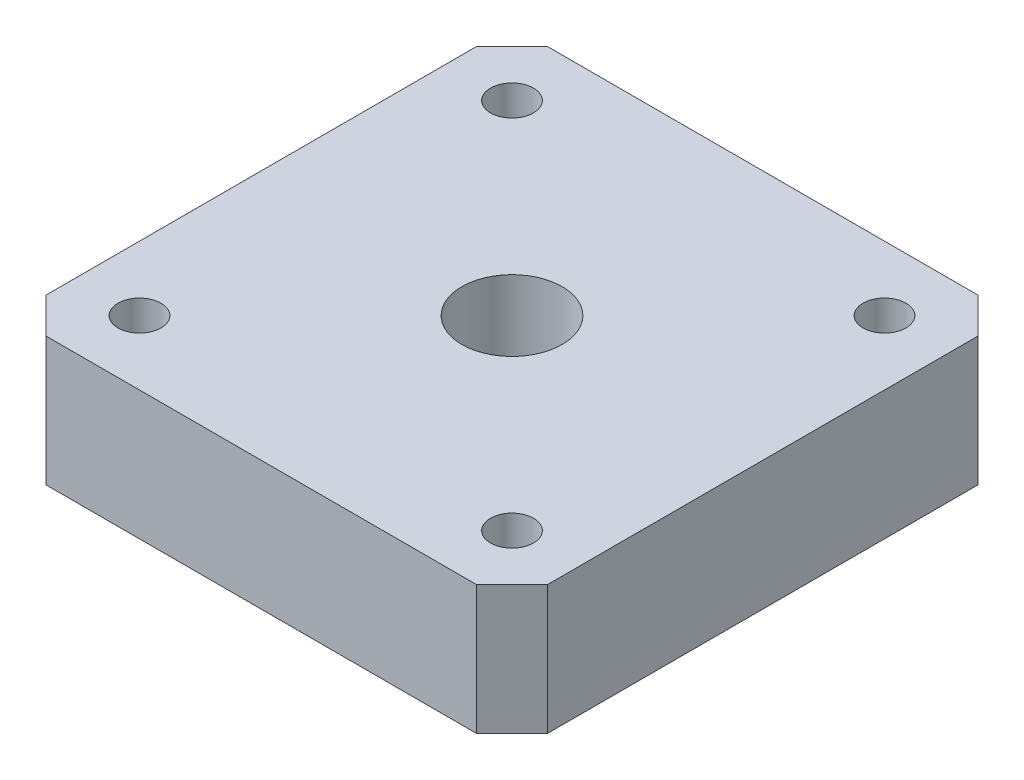
ISO-10303-21;
HEADER;
FILE_DESCRIPTION(('STEP AP214'),'2;1');
FILE_NAME('part.step','',(''),(''),'','','');
FILE_SCHEMA(('AUTOMOTIVE_DESIGN { 1 0 10303 214 1 1 1 1 }'));
ENDSEC;
DATA;
#1=APPLICATION_CONTEXT('core data for automotive mechanical design processes');
#2=APPLICATION_PROTOCOL_DEFINITION('international standard','automotive_design',2000,#1);
#3=PRODUCT_CONTEXT('',#1,'mechanical');
#4=PRODUCT('Part','Part','',(#3));
#5=PRODUCT_RELATED_PRODUCT_CATEGORY('part','',(#4));
#6=PRODUCT_DEFINITION_FORMATION('','',#4);
#7=PRODUCT_DEFINITION_CONTEXT('part definition',#1,'design');
#8=PRODUCT_DEFINITION('design','',#6,#7);
#9=PRODUCT_DEFINITION_SHAPE('','',#8);
#10=(LENGTH_UNIT() NAMED_UNIT(*) SI_UNIT(.MILLI.,.METRE.));
#11=(NAMED_UNIT(*) PLANE_ANGLE_UNIT() SI_UNIT($,.RADIAN.));
#12=(NAMED_UNIT(*) SI_UNIT($,.STERADIAN.) SOLID_ANGLE_UNIT());
#13=UNCERTAINTY_MEASURE_WITH_UNIT(LENGTH_MEASURE(1.E-05),#10,'distance_accuracy_value','');
#14=(GEOMETRIC_REPRESENTATION_CONTEXT(3) GLOBAL_UNCERTAINTY_ASSIGNED_CONTEXT((#13)) GLOBAL_UNIT_ASSIGNED_CONTEXT((#10,
#11,#12)) REPRESENTATION_CONTEXT('',''));
#15=CARTESIAN_POINT('',(0.,0.,0.));
#16=DIRECTION('',(0.,0.,1.));
#17=DIRECTION('',(1.,0.,0.));
#18=AXIS2_PLACEMENT_3D('',#15,#16,#17);
#19=CARTESIAN_POINT('',(0.,9.,-32.5269119345811));
#20=DIRECTION('',(1.,0.,0.));
#21=DIRECTION('',(0.,0.,-1.));
#22=AXIS2_PLACEMENT_3D('',#19,#20,#21);
#23=PLANE('',#22);
#24=DIRECTION('',(0.,0.,1.));
#25=VECTOR('',#24,1.);
#26=CARTESIAN_POINT('',(0.,0.,-32.5269119345811));
#27=LINE('',#26,#25);
#28=CARTESIAN_POINT('',(0.,0.,-32.5269119345811));
#29=VERTEX_POINT('',#28);
#30=CARTESIAN_POINT('',(0.,0.,-2.47308806541876));
#31=VERTEX_POINT('',#30);
#32=EDGE_CURVE('E129',#29,#31,#27,.T.);
#33=ORIENTED_EDGE('',*,*,#32,.T.);
#34=DIRECTION('',(0.,-1.,0.));
#35=VECTOR('',#34,1.);
#36=CARTESIAN_POINT('',(0.,9.,-2.47308806541876));
#37=LINE('',#36,#35);
#38=CARTESIAN_POINT('',(0.,9.,-2.47308806541876));
#39=VERTEX_POINT('',#38);
#40=EDGE_CURVE('E11',#39,#31,#37,.T.);
#41=ORIENTED_EDGE('',*,*,#40,.F.);
#42=DIRECTION('',(0.,0.,1.));
#43=VECTOR('',#42,1.);
#44=CARTESIAN_POINT('',(0.,9.,-32.5269119345811));
#45=LINE('',#44,#43);
#46=CARTESIAN_POINT('',(0.,9.,-32.5269119345811));
#47=VERTEX_POINT('',#46);
#48=EDGE_CURVE('E144',#47,#39,#45,.T.);
#49=ORIENTED_EDGE('',*,*,#48,.F.);
#50=DIRECTION('',(0.,-1.,0.));
#51=VECTOR('',#50,1.);
#52=CARTESIAN_POINT('',(0.,9.,-32.5269119345811));
#53=LINE('',#52,#51);
#54=EDGE_CURVE('E125',#47,#29,#53,.T.);
#55=ORIENTED_EDGE('',*,*,#54,.T.);
#56=EDGE_LOOP('',(#33,#41,#49,#55));
#57=FACE_BOUND('',#56,.T.);
#58=ADVANCED_FACE('F33',(#57),#23,.F.);
#59=CARTESIAN_POINT('',(0.,9.,-2.47308806541876));
#60=DIRECTION('',(0.707106781186549,0.,-0.707106781186546));
#61=DIRECTION('',(-0.707106781186546,0.,-0.707106781186549));
#62=AXIS2_PLACEMENT_3D('',#59,#60,#61);
#63=PLANE('',#62);
#64=DIRECTION('',(0.707106781186546,0.,0.707106781186548));
#65=VECTOR('',#64,1.);
#66=CARTESIAN_POINT('',(0.,0.,-2.47308806541876));
#67=LINE('',#66,#65);
#68=CARTESIAN_POINT('',(2.47308806541877,0.,0.));
#69=VERTEX_POINT('',#68);
#70=EDGE_CURVE('E132',#31,#69,#67,.T.);
#71=ORIENTED_EDGE('',*,*,#70,.T.);
#72=DIRECTION('',(0.,-1.,0.));
#73=VECTOR('',#72,1.);
#74=CARTESIAN_POINT('',(2.47308806541877,9.,0.));
#75=LINE('',#74,#73);
#76=CARTESIAN_POINT('',(2.47308806541877,9.,0.));
#77=VERTEX_POINT('',#76);
#78=EDGE_CURVE('E41',#77,#69,#75,.T.);
#79=ORIENTED_EDGE('',*,*,#78,.F.);
#80=DIRECTION('',(0.707106781186546,0.,0.707106781186548));
#81=VECTOR('',#80,1.);
#82=CARTESIAN_POINT('',(0.,9.,-2.47308806541876));
#83=LINE('',#82,#81);
#84=EDGE_CURVE('E92',#39,#77,#83,.T.);
#85=ORIENTED_EDGE('',*,*,#84,.F.);
#86=ORIENTED_EDGE('',*,*,#40,.T.);
#87=EDGE_LOOP('',(#71,#79,#85,#86));
#88=FACE_BOUND('',#87,.T.);
#89=ADVANCED_FACE('F244',(#88),#63,.F.);
#90=CARTESIAN_POINT('',(2.47308806541877,9.,0.));
#91=DIRECTION('',(0.,0.,-1.));
#92=DIRECTION('',(-1.,0.,0.));
#93=AXIS2_PLACEMENT_3D('',#90,#91,#92);
#94=PLANE('',#93);
#95=DIRECTION('',(1.,0.,0.));
#96=VECTOR('',#95,1.);
#97=CARTESIAN_POINT('',(2.47308806541877,0.,0.));
#98=LINE('',#97,#96);
#99=CARTESIAN_POINT('',(32.5269119345812,0.,0.));
#100=VERTEX_POINT('',#99);
#101=EDGE_CURVE('E135',#69,#100,#98,.T.);
#102=ORIENTED_EDGE('',*,*,#101,.T.);
#103=DIRECTION('',(0.,-1.,0.));
#104=VECTOR('',#103,1.);
#105=CARTESIAN_POINT('',(32.5269119345812,9.,0.));
#106=LINE('',#105,#104);
#107=CARTESIAN_POINT('',(32.5269119345812,9.,0.));
#108=VERTEX_POINT('',#107);
#109=EDGE_CURVE('E151',#108,#100,#106,.T.);
#110=ORIENTED_EDGE('',*,*,#109,.F.);
#111=DIRECTION('',(1.,0.,0.));
#112=VECTOR('',#111,1.);
#113=CARTESIAN_POINT('',(2.47308806541877,9.,0.));
#114=LINE('',#113,#112);
#115=EDGE_CURVE('E159',#77,#108,#114,.T.);
#116=ORIENTED_EDGE('',*,*,#115,.F.);
#117=ORIENTED_EDGE('',*,*,#78,.T.);
#118=EDGE_LOOP('',(#102,#110,#116,#117));
#119=FACE_BOUND('',#118,.T.);
#120=ADVANCED_FACE('F157',(#119),#94,.F.);
#121=CARTESIAN_POINT('',(32.5269119345812,9.,0.));
#122=DIRECTION('',(-0.707106781186545,0.,-0.70710678118655));
#123=DIRECTION('',(-0.70710678118655,0.,0.707106781186545));
#124=AXIS2_PLACEMENT_3D('',#121,#122,#123);
#125=PLANE('',#124);
#126=DIRECTION('',(0.70710678118655,0.,-0.707106781186545));
#127=VECTOR('',#126,1.);
#128=CARTESIAN_POINT('',(32.5269119345812,0.,0.));
#129=LINE('',#128,#127);
#130=CARTESIAN_POINT('',(35.,0.,-2.47308806541876));
#131=VERTEX_POINT('',#130);
#132=EDGE_CURVE('E137',#100,#131,#129,.T.);
#133=ORIENTED_EDGE('',*,*,#132,.T.);
#134=DIRECTION('',(0.,-1.,0.));
#135=VECTOR('',#134,1.);
#136=CARTESIAN_POINT('',(35.,9.,-2.47308806541876));
#137=LINE('',#136,#135);
#138=CARTESIAN_POINT('',(35.,9.,-2.47308806541876));
#139=VERTEX_POINT('',#138);
#140=EDGE_CURVE('E148',#139,#131,#137,.T.);
#141=ORIENTED_EDGE('',*,*,#140,.F.);
#142=DIRECTION('',(0.70710678118655,0.,-0.707106781186545));
#143=VECTOR('',#142,1.);
#144=CARTESIAN_POINT('',(32.5269119345812,9.,0.));
#145=LINE('',#144,#143);
#146=EDGE_CURVE('E171',#108,#139,#145,.T.);
#147=ORIENTED_EDGE('',*,*,#146,.F.);
#148=ORIENTED_EDGE('',*,*,#109,.T.);
#149=EDGE_LOOP('',(#133,#141,#147,#148));
#150=FACE_BOUND('',#149,.T.);
#151=ADVANCED_FACE('F167',(#150),#125,.F.);
#152=CARTESIAN_POINT('',(35.,9.,-2.47308806541876));
#153=DIRECTION('',(-1.,0.,0.));
#154=DIRECTION('',(0.,0.,1.));
#155=AXIS2_PLACEMENT_3D('',#152,#153,#154);
#156=PLANE('',#155);
#157=DIRECTION('',(0.,0.,-1.));
#158=VECTOR('',#157,1.);
#159=CARTESIAN_POINT('',(35.,0.,-2.47308806541876));
#160=LINE('',#159,#158);
#161=CARTESIAN_POINT('',(35.,0.,-32.5269119345811));
#162=VERTEX_POINT('',#161);
#163=EDGE_CURVE('E139',#131,#162,#160,.T.);
#164=ORIENTED_EDGE('',*,*,#163,.T.);
#165=DIRECTION('',(0.,-1.,0.));
#166=VECTOR('',#165,1.);
#167=CARTESIAN_POINT('',(35.,9.,-32.5269119345811));
#168=LINE('',#167,#166);
#169=CARTESIAN_POINT('',(35.,9.,-32.5269119345811));
#170=VERTEX_POINT('',#169);
#171=EDGE_CURVE('E120',#170,#162,#168,.T.);
#172=ORIENTED_EDGE('',*,*,#171,.F.);
#173=DIRECTION('',(0.,0.,-1.));
#174=VECTOR('',#173,1.);
#175=CARTESIAN_POINT('',(35.,9.,-2.47308806541876));
#176=LINE('',#175,#174);
#177=EDGE_CURVE('E111',#139,#170,#176,.T.);
#178=ORIENTED_EDGE('',*,*,#177,.F.);
#179=ORIENTED_EDGE('',*,*,#140,.T.);
#180=EDGE_LOOP('',(#164,#172,#178,#179));
#181=FACE_BOUND('',#180,.T.);
#182=ADVANCED_FACE('F170',(#181),#156,.F.);
#183=CARTESIAN_POINT('',(35.,9.,-32.5269119345811));
#184=DIRECTION('',(-0.707106781186548,0.,0.707106781186547));
#185=DIRECTION('',(0.707106781186547,0.,0.707106781186548));
#186=AXIS2_PLACEMENT_3D('',#183,#184,#185);
#187=PLANE('',#186);
#188=DIRECTION('',(-0.707106781186547,0.,-0.707106781186549));
#189=VECTOR('',#188,1.);
#190=CARTESIAN_POINT('',(35.,0.,-32.5269119345811));
#191=LINE('',#190,#189);
#192=CARTESIAN_POINT('',(32.5269119345812,0.,-34.9999999999999));
#193=VERTEX_POINT('',#192);
#194=EDGE_CURVE('E119',#162,#193,#191,.T.);
#195=ORIENTED_EDGE('',*,*,#194,.T.);
#196=DIRECTION('',(0.,-1.,0.));
#197=VECTOR('',#196,1.);
#198=CARTESIAN_POINT('',(32.5269119345812,9.,-34.9999999999999));
#199=LINE('',#198,#197);
#200=CARTESIAN_POINT('',(32.5269119345812,9.,-34.9999999999999));
#201=VERTEX_POINT('',#200);
#202=EDGE_CURVE('E116',#201,#193,#199,.T.);
#203=ORIENTED_EDGE('',*,*,#202,.F.);
#204=DIRECTION('',(-0.707106781186547,0.,-0.707106781186549));
#205=VECTOR('',#204,1.);
#206=CARTESIAN_POINT('',(35.,9.,-32.5269119345811));
#207=LINE('',#206,#205);
#208=EDGE_CURVE('E105',#170,#201,#207,.T.);
#209=ORIENTED_EDGE('',*,*,#208,.F.);
#210=ORIENTED_EDGE('',*,*,#171,.T.);
#211=EDGE_LOOP('',(#195,#203,#209,#210));
#212=FACE_BOUND('',#211,.T.);
#213=ADVANCED_FACE('F117',(#212),#187,.F.);
#214=CARTESIAN_POINT('',(32.5269119345812,9.,-34.9999999999999));
#215=DIRECTION('',(0.,0.,1.));
#216=DIRECTION('',(1.,0.,0.));
#217=AXIS2_PLACEMENT_3D('',#214,#215,#216);
#218=PLANE('',#217);
#219=DIRECTION('',(-1.,0.,0.));
#220=VECTOR('',#219,1.);
#221=CARTESIAN_POINT('',(32.5269119345812,0.,-34.9999999999999));
#222=LINE('',#221,#220);
#223=CARTESIAN_POINT('',(2.47308806541877,0.,-34.9999999999999));
#224=VERTEX_POINT('',#223);
#225=EDGE_CURVE('E78',#193,#224,#222,.T.);
#226=ORIENTED_EDGE('',*,*,#225,.T.);
#227=DIRECTION('',(0.,-1.,0.));
#228=VECTOR('',#227,1.);
#229=CARTESIAN_POINT('',(2.47308806541877,9.,-34.9999999999999));
#230=LINE('',#229,#228);
#231=CARTESIAN_POINT('',(2.47308806541877,9.,-34.9999999999999));
#232=VERTEX_POINT('',#231);
#233=EDGE_CURVE('E121',#232,#224,#230,.T.);
#234=ORIENTED_EDGE('',*,*,#233,.F.);
#235=DIRECTION('',(-1.,0.,0.));
#236=VECTOR('',#235,1.);
#237=CARTESIAN_POINT('',(32.5269119345812,9.,-34.9999999999999));
#238=LINE('',#237,#236);
#239=EDGE_CURVE('E109',#201,#232,#238,.T.);
#240=ORIENTED_EDGE('',*,*,#239,.F.);
#241=ORIENTED_EDGE('',*,*,#202,.T.);
#242=EDGE_LOOP('',(#226,#234,#240,#241));
#243=FACE_BOUND('',#242,.T.);
#244=ADVANCED_FACE('F123',(#243),#218,.F.);
#245=CARTESIAN_POINT('',(2.47308806541877,9.,-34.9999999999999));
#246=DIRECTION('',(0.707106781186547,0.,0.707106781186548));
#247=DIRECTION('',(0.707106781186548,0.,-0.707106781186547));
#248=AXIS2_PLACEMENT_3D('',#245,#246,#247);
#249=PLANE('',#248);
#250=DIRECTION('',(-0.707106781186549,0.,0.707106781186547));
#251=VECTOR('',#250,1.);
#252=CARTESIAN_POINT('',(2.47308806541877,0.,-34.9999999999999));
#253=LINE('',#252,#251);
#254=EDGE_CURVE('E84',#224,#29,#253,.T.);
#255=ORIENTED_EDGE('',*,*,#254,.T.);
#256=ORIENTED_EDGE('',*,*,#54,.F.);
#257=DIRECTION('',(-0.707106781186549,0.,0.707106781186547));
#258=VECTOR('',#257,1.);
#259=CARTESIAN_POINT('',(2.47308806541877,9.,-34.9999999999999));
#260=LINE('',#259,#258);
#261=EDGE_CURVE('E49',#232,#47,#260,.T.);
#262=ORIENTED_EDGE('',*,*,#261,.F.);
#263=ORIENTED_EDGE('',*,*,#233,.T.);
#264=EDGE_LOOP('',(#255,#256,#262,#263));
#265=FACE_BOUND('',#264,.T.);
#266=ADVANCED_FACE('F218',(#265),#249,.F.);
#267=CARTESIAN_POINT('',(0.,9.,0.));
#268=DIRECTION('',(0.,1.,0.));
#269=DIRECTION('',(0.,0.,1.));
#270=AXIS2_PLACEMENT_3D('',#267,#268,#269);
#271=PLANE('',#270);
#272=CARTESIAN_POINT('',(4.5000000000006,9.,-4.50000000000008));
#273=DIRECTION('',(0.,1.,0.));
#274=DIRECTION('',(0.,0.,1.));
#275=AXIS2_PLACEMENT_3D('',#272,#273,#274);
#276=CIRCLE('',#275,1.5);
#277=CARTESIAN_POINT('',(4.5000000000006,9.,-3.00000000000007));
#278=VERTEX_POINT('',#277);
#279=EDGE_CURVE('E201',#278,#278,#276,.T.);
#280=ORIENTED_EDGE('',*,*,#279,.F.);
#281=EDGE_LOOP('',(#280));
#282=FACE_BOUND('',#281,.T.);
#283=CARTESIAN_POINT('',(30.5000000000006,9.,-4.50000000000058));
#284=DIRECTION('',(0.,1.,0.));
#285=DIRECTION('',(0.,0.,1.));
#286=AXIS2_PLACEMENT_3D('',#283,#284,#285);
#287=CIRCLE('',#286,1.5);
#288=CARTESIAN_POINT('',(30.5000000000006,9.,-3.00000000000058));
#289=VERTEX_POINT('',#288);
#290=EDGE_CURVE('E195',#289,#289,#287,.T.);
#291=ORIENTED_EDGE('',*,*,#290,.F.);
#292=EDGE_LOOP('',(#291));
#293=FACE_BOUND('',#292,.T.);
#294=CARTESIAN_POINT('',(30.5,9.,-30.5000000000006));
#295=DIRECTION('',(0.,1.,0.));
#296=DIRECTION('',(0.,0.,1.));
#297=AXIS2_PLACEMENT_3D('',#294,#295,#296);
#298=CIRCLE('',#297,1.5);
#299=CARTESIAN_POINT('',(30.5,9.,-29.0000000000006));
#300=VERTEX_POINT('',#299);
#301=EDGE_CURVE('E189',#300,#300,#298,.T.);
#302=ORIENTED_EDGE('',*,*,#301,.F.);
#303=EDGE_LOOP('',(#302));
#304=FACE_BOUND('',#303,.T.);
#305=CARTESIAN_POINT('',(4.5,9.,-30.4999999999999));
#306=DIRECTION('',(0.,1.,0.));
#307=DIRECTION('',(0.,0.,1.));
#308=AXIS2_PLACEMENT_3D('',#305,#306,#307);
#309=CIRCLE('',#308,1.5);
#310=CARTESIAN_POINT('',(4.5,9.,-28.9999999999999));
#311=VERTEX_POINT('',#310);
#312=EDGE_CURVE('E183',#311,#311,#309,.T.);
#313=ORIENTED_EDGE('',*,*,#312,.F.);
#314=EDGE_LOOP('',(#313));
#315=FACE_BOUND('',#314,.T.);
#316=CARTESIAN_POINT('',(17.5,9.,-17.4999999999999));
#317=DIRECTION('',(0.,1.,0.));
#318=DIRECTION('',(0.,0.,1.));
#319=AXIS2_PLACEMENT_3D('',#316,#317,#318);
#320=CIRCLE('',#319,3.5);
#321=CARTESIAN_POINT('',(17.5,9.,-13.9999999999999));
#322=VERTEX_POINT('',#321);
#323=EDGE_CURVE('E177',#322,#322,#320,.T.);
#324=ORIENTED_EDGE('',*,*,#323,.F.);
#325=EDGE_LOOP('',(#324));
#326=FACE_BOUND('',#325,.T.);
#327=ORIENTED_EDGE('',*,*,#48,.T.);
#328=ORIENTED_EDGE('',*,*,#84,.T.);
#329=ORIENTED_EDGE('',*,*,#115,.T.);
#330=ORIENTED_EDGE('',*,*,#146,.T.);
#331=ORIENTED_EDGE('',*,*,#177,.T.);
#332=ORIENTED_EDGE('',*,*,#208,.T.);
#333=ORIENTED_EDGE('',*,*,#239,.T.);
#334=ORIENTED_EDGE('',*,*,#261,.T.);
#335=EDGE_LOOP('',(#327,#328,#329,#330,#331,#332,#333,#334));
#336=FACE_BOUND('',#335,.T.);
#337=ADVANCED_FACE('F107',(#282,#293,#304,#315,#326,#336),#271,.T.);
#338=CARTESIAN_POINT('',(0.,0.,0.));
#339=DIRECTION('',(0.,1.,0.));
#340=DIRECTION('',(0.,0.,1.));
#341=AXIS2_PLACEMENT_3D('',#338,#339,#340);
#342=PLANE('',#341);
#343=CARTESIAN_POINT('',(4.5000000000006,0.,-4.50000000000008));
#344=DIRECTION('',(0.,1.,0.));
#345=DIRECTION('',(0.,0.,1.));
#346=AXIS2_PLACEMENT_3D('',#343,#344,#345);
#347=CIRCLE('',#346,1.5);
#348=CARTESIAN_POINT('',(4.5000000000006,0.,-3.00000000000007));
#349=VERTEX_POINT('',#348);
#350=EDGE_CURVE('E198',#349,#349,#347,.T.);
#351=ORIENTED_EDGE('',*,*,#350,.T.);
#352=EDGE_LOOP('',(#351));
#353=FACE_BOUND('',#352,.T.);
#354=CARTESIAN_POINT('',(30.5000000000006,0.,-4.50000000000058));
#355=DIRECTION('',(0.,1.,0.));
#356=DIRECTION('',(0.,0.,1.));
#357=AXIS2_PLACEMENT_3D('',#354,#355,#356);
#358=CIRCLE('',#357,1.5);
#359=CARTESIAN_POINT('',(30.5000000000006,0.,-3.00000000000058));
#360=VERTEX_POINT('',#359);
#361=EDGE_CURVE('E192',#360,#360,#358,.T.);
#362=ORIENTED_EDGE('',*,*,#361,.T.);
#363=EDGE_LOOP('',(#362));
#364=FACE_BOUND('',#363,.T.);
#365=CARTESIAN_POINT('',(30.5,0.,-30.5000000000006));
#366=DIRECTION('',(0.,1.,0.));
#367=DIRECTION('',(0.,0.,1.));
#368=AXIS2_PLACEMENT_3D('',#365,#366,#367);
#369=CIRCLE('',#368,1.5);
#370=CARTESIAN_POINT('',(30.5,0.,-29.0000000000006));
#371=VERTEX_POINT('',#370);
#372=EDGE_CURVE('E186',#371,#371,#369,.T.);
#373=ORIENTED_EDGE('',*,*,#372,.T.);
#374=EDGE_LOOP('',(#373));
#375=FACE_BOUND('',#374,.T.);
#376=CARTESIAN_POINT('',(4.5,0.,-30.4999999999999));
#377=DIRECTION('',(0.,1.,0.));
#378=DIRECTION('',(0.,0.,1.));
#379=AXIS2_PLACEMENT_3D('',#376,#377,#378);
#380=CIRCLE('',#379,1.5);
#381=CARTESIAN_POINT('',(4.5,0.,-28.9999999999999));
#382=VERTEX_POINT('',#381);
#383=EDGE_CURVE('E180',#382,#382,#380,.T.);
#384=ORIENTED_EDGE('',*,*,#383,.T.);
#385=EDGE_LOOP('',(#384));
#386=FACE_BOUND('',#385,.T.);
#387=CARTESIAN_POINT('',(17.5,0.,-17.4999999999999));
#388=DIRECTION('',(0.,1.,0.));
#389=DIRECTION('',(0.,0.,1.));
#390=AXIS2_PLACEMENT_3D('',#387,#388,#389);
#391=CIRCLE('',#390,3.5);
#392=CARTESIAN_POINT('',(17.5,0.,-13.9999999999999));
#393=VERTEX_POINT('',#392);
#394=EDGE_CURVE('E133',#393,#393,#391,.T.);
#395=ORIENTED_EDGE('',*,*,#394,.T.);
#396=EDGE_LOOP('',(#395));
#397=FACE_BOUND('',#396,.T.);
#398=ORIENTED_EDGE('',*,*,#32,.F.);
#399=ORIENTED_EDGE('',*,*,#254,.F.);
#400=ORIENTED_EDGE('',*,*,#225,.F.);
#401=ORIENTED_EDGE('',*,*,#194,.F.);
#402=ORIENTED_EDGE('',*,*,#163,.F.);
#403=ORIENTED_EDGE('',*,*,#132,.F.);
#404=ORIENTED_EDGE('',*,*,#101,.F.);
#405=ORIENTED_EDGE('',*,*,#70,.F.);
#406=EDGE_LOOP('',(#398,#399,#400,#401,#402,#403,#404,#405));
#407=FACE_BOUND('',#406,.T.);
#408=ADVANCED_FACE('F163',(#353,#364,#375,#386,#397,#407),#342,.F.);
#409=CARTESIAN_POINT('',(17.5,0.,-17.4999999999999));
#410=DIRECTION('',(0.,1.,0.));
#411=DIRECTION('',(0.,0.,1.));
#412=AXIS2_PLACEMENT_3D('',#409,#410,#411);
#413=CYLINDRICAL_SURFACE('',#412,3.5);
#414=ORIENTED_EDGE('',*,*,#394,.F.);
#415=EDGE_LOOP('',(#414));
#416=FACE_BOUND('',#415,.T.);
#417=ORIENTED_EDGE('',*,*,#323,.T.);
#418=EDGE_LOOP('',(#417));
#419=FACE_BOUND('',#418,.T.);
#420=ADVANCED_FACE('F228',(#416,#419),#413,.F.);
#421=CARTESIAN_POINT('',(4.5,0.,-30.4999999999999));
#422=DIRECTION('',(0.,1.,0.));
#423=DIRECTION('',(0.,0.,1.));
#424=AXIS2_PLACEMENT_3D('',#421,#422,#423);
#425=CYLINDRICAL_SURFACE('',#424,1.5);
#426=ORIENTED_EDGE('',*,*,#383,.F.);
#427=EDGE_LOOP('',(#426));
#428=FACE_BOUND('',#427,.T.);
#429=ORIENTED_EDGE('',*,*,#312,.T.);
#430=EDGE_LOOP('',(#429));
#431=FACE_BOUND('',#430,.T.);
#432=ADVANCED_FACE('F230',(#428,#431),#425,.F.);
#433=CARTESIAN_POINT('',(30.5,0.,-30.5000000000006));
#434=DIRECTION('',(0.,1.,0.));
#435=DIRECTION('',(0.,0.,1.));
#436=AXIS2_PLACEMENT_3D('',#433,#434,#435);
#437=CYLINDRICAL_SURFACE('',#436,1.5);
#438=ORIENTED_EDGE('',*,*,#372,.F.);
#439=EDGE_LOOP('',(#438));
#440=FACE_BOUND('',#439,.T.);
#441=ORIENTED_EDGE('',*,*,#301,.T.);
#442=EDGE_LOOP('',(#441));
#443=FACE_BOUND('',#442,.T.);
#444=ADVANCED_FACE('F237',(#440,#443),#437,.F.);
#445=CARTESIAN_POINT('',(30.5000000000006,0.,-4.50000000000058));
#446=DIRECTION('',(0.,1.,0.));
#447=DIRECTION('',(0.,0.,1.));
#448=AXIS2_PLACEMENT_3D('',#445,#446,#447);
#449=CYLINDRICAL_SURFACE('',#448,1.5);
#450=ORIENTED_EDGE('',*,*,#361,.F.);
#451=EDGE_LOOP('',(#450));
#452=FACE_BOUND('',#451,.T.);
#453=ORIENTED_EDGE('',*,*,#290,.T.);
#454=EDGE_LOOP('',(#453));
#455=FACE_BOUND('',#454,.T.);
#456=ADVANCED_FACE('F212',(#452,#455),#449,.F.);
#457=CARTESIAN_POINT('',(4.5000000000006,0.,-4.50000000000008));
#458=DIRECTION('',(0.,1.,0.));
#459=DIRECTION('',(0.,0.,1.));
#460=AXIS2_PLACEMENT_3D('',#457,#458,#459);
#461=CYLINDRICAL_SURFACE('',#460,1.5);
#462=ORIENTED_EDGE('',*,*,#350,.F.);
#463=EDGE_LOOP('',(#462));
#464=FACE_BOUND('',#463,.T.);
#465=ORIENTED_EDGE('',*,*,#279,.T.);
#466=EDGE_LOOP('',(#465));
#467=FACE_BOUND('',#466,.T.);
#468=ADVANCED_FACE('F209',(#464,#467),#461,.F.);
#469=CLOSED_SHELL('',(#58,#89,#120,#151,#182,#213,#244,#266,#337,#408,#420,#432,#444,#456,#468));
#470=MANIFOLD_SOLID_BREP('B2',#469);
#471=ADVANCED_BREP_SHAPE_REPRESENTATION('',(#18,#470),#14);
#472=SHAPE_DEFINITION_REPRESENTATION(#9,#471);
ENDSEC;
END-ISO-10303-21;
